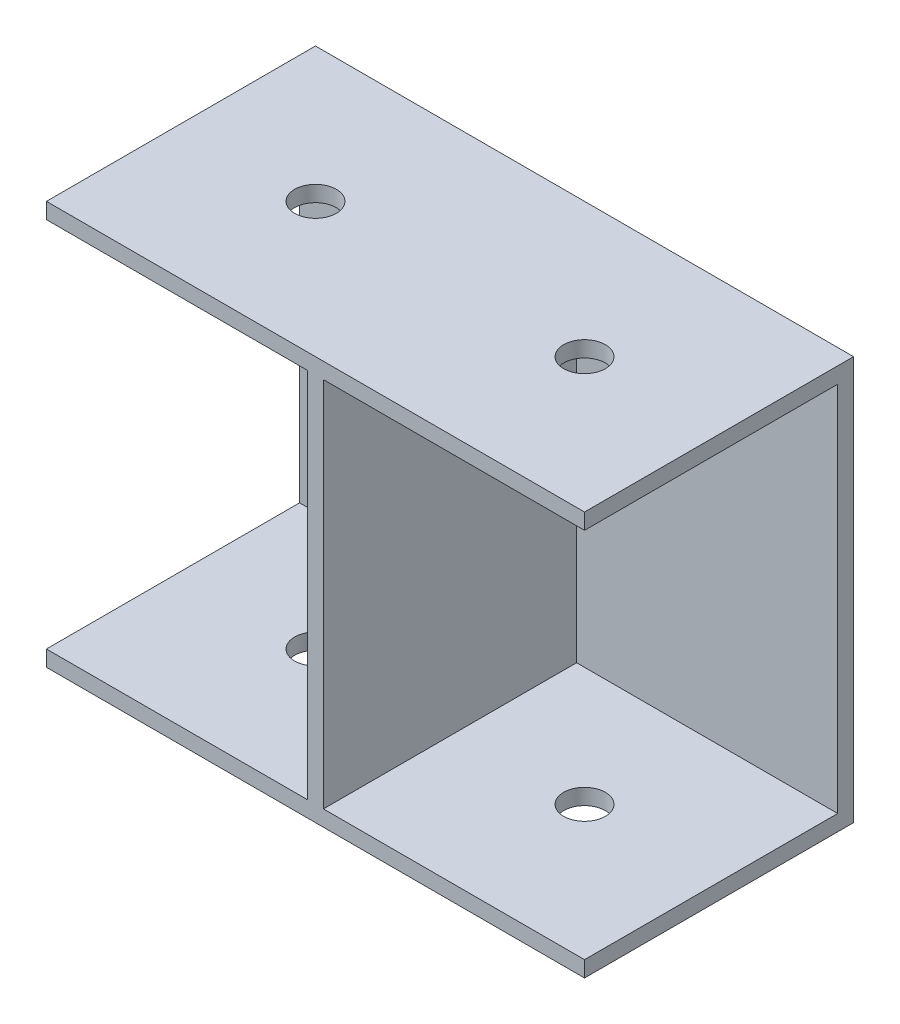
ISO-10303-21;
HEADER;
FILE_DESCRIPTION(('STEP AP214'),'2;1');
FILE_NAME('part.step','',(''),(''),'','','');
FILE_SCHEMA(('AUTOMOTIVE_DESIGN { 1 0 10303 214 1 1 1 1 }'));
ENDSEC;
DATA;
#1=APPLICATION_CONTEXT('core data for automotive mechanical design processes');
#2=APPLICATION_PROTOCOL_DEFINITION('international standard','automotive_design',2000,#1);
#3=PRODUCT_CONTEXT('',#1,'mechanical');
#4=PRODUCT('Part','Part','',(#3));
#5=PRODUCT_RELATED_PRODUCT_CATEGORY('part','',(#4));
#6=PRODUCT_DEFINITION_FORMATION('','',#4);
#7=PRODUCT_DEFINITION_CONTEXT('part definition',#1,'design');
#8=PRODUCT_DEFINITION('design','',#6,#7);
#9=PRODUCT_DEFINITION_SHAPE('','',#8);
#10=(LENGTH_UNIT() NAMED_UNIT(*) SI_UNIT(.MILLI.,.METRE.));
#11=(NAMED_UNIT(*) PLANE_ANGLE_UNIT() SI_UNIT($,.RADIAN.));
#12=(NAMED_UNIT(*) SI_UNIT($,.STERADIAN.) SOLID_ANGLE_UNIT());
#13=UNCERTAINTY_MEASURE_WITH_UNIT(LENGTH_MEASURE(1.E-05),#10,'distance_accuracy_value','');
#14=(GEOMETRIC_REPRESENTATION_CONTEXT(3) GLOBAL_UNCERTAINTY_ASSIGNED_CONTEXT((#13)) GLOBAL_UNIT_ASSIGNED_CONTEXT((#10,
#11,#12)) REPRESENTATION_CONTEXT('',''));
#15=CARTESIAN_POINT('',(0.,0.,0.));
#16=DIRECTION('',(0.,0.,1.));
#17=DIRECTION('',(1.,0.,0.));
#18=AXIS2_PLACEMENT_3D('',#15,#16,#17);
#19=CARTESIAN_POINT('',(50.8,-38.1,50.8));
#20=DIRECTION('',(-1.,0.,0.));
#21=DIRECTION('',(0.,0.,1.));
#22=AXIS2_PLACEMENT_3D('',#19,#20,#21);
#23=PLANE('',#22);
#24=DIRECTION('',(0.,1.,0.));
#25=VECTOR('',#24,1.);
#26=CARTESIAN_POINT('',(50.8,-38.1,50.8));
#27=LINE('',#26,#25);
#28=CARTESIAN_POINT('',(50.8,35.1,50.8));
#29=VERTEX_POINT('',#28);
#30=CARTESIAN_POINT('',(50.8,38.1,50.8));
#31=VERTEX_POINT('',#30);
#32=EDGE_CURVE('E191',#29,#31,#27,.T.);
#33=ORIENTED_EDGE('',*,*,#32,.F.);
#34=DIRECTION('',(0.,0.,1.));
#35=VECTOR('',#34,1.);
#36=CARTESIAN_POINT('',(50.8,35.1,3.));
#37=LINE('',#36,#35);
#38=CARTESIAN_POINT('',(50.8,35.1,3.));
#39=VERTEX_POINT('',#38);
#40=EDGE_CURVE('E181',#39,#29,#37,.T.);
#41=ORIENTED_EDGE('',*,*,#40,.F.);
#42=DIRECTION('',(0.,1.,0.));
#43=VECTOR('',#42,1.);
#44=CARTESIAN_POINT('',(50.8,-35.1,3.));
#45=LINE('',#44,#43);
#46=CARTESIAN_POINT('',(50.8,-35.1,3.));
#47=VERTEX_POINT('',#46);
#48=EDGE_CURVE('E167',#47,#39,#45,.T.);
#49=ORIENTED_EDGE('',*,*,#48,.F.);
#50=DIRECTION('',(0.,0.,1.));
#51=VECTOR('',#50,1.);
#52=CARTESIAN_POINT('',(50.8,-35.1,3.));
#53=LINE('',#52,#51);
#54=CARTESIAN_POINT('',(50.8,-35.1,50.8));
#55=VERTEX_POINT('',#54);
#56=EDGE_CURVE('E183',#47,#55,#53,.T.);
#57=ORIENTED_EDGE('',*,*,#56,.T.);
#58=CARTESIAN_POINT('',(50.8,-38.1,50.8));
#59=VERTEX_POINT('',#58);
#60=EDGE_CURVE('E187',#59,#55,#27,.T.);
#61=ORIENTED_EDGE('',*,*,#60,.F.);
#62=DIRECTION('',(0.,0.,-1.));
#63=VECTOR('',#62,1.);
#64=CARTESIAN_POINT('',(50.8,-38.1,50.8));
#65=LINE('',#64,#63);
#66=CARTESIAN_POINT('',(50.8,-38.1,0.));
#67=VERTEX_POINT('',#66);
#68=EDGE_CURVE('E199',#59,#67,#65,.T.);
#69=ORIENTED_EDGE('',*,*,#68,.T.);
#70=DIRECTION('',(0.,1.,0.));
#71=VECTOR('',#70,1.);
#72=CARTESIAN_POINT('',(50.8,-38.1,0.));
#73=LINE('',#72,#71);
#74=CARTESIAN_POINT('',(50.8,38.1,0.));
#75=VERTEX_POINT('',#74);
#76=EDGE_CURVE('E180',#67,#75,#73,.T.);
#77=ORIENTED_EDGE('',*,*,#76,.T.);
#78=DIRECTION('',(0.,0.,-1.));
#79=VECTOR('',#78,1.);
#80=CARTESIAN_POINT('',(50.8,38.1,50.8));
#81=LINE('',#80,#79);
#82=EDGE_CURVE('E11',#31,#75,#81,.T.);
#83=ORIENTED_EDGE('',*,*,#82,.F.);
#84=EDGE_LOOP('',(#33,#41,#49,#57,#61,#69,#77,#83));
#85=FACE_BOUND('',#84,.T.);
#86=ADVANCED_FACE('F32',(#85),#23,.F.);
#87=CARTESIAN_POINT('',(-50.8,38.1,50.8));
#88=DIRECTION('',(0.,-1.,0.));
#89=DIRECTION('',(0.,0.,-1.));
#90=AXIS2_PLACEMENT_3D('',#87,#88,#89);
#91=PLANE('',#90);
#92=CARTESIAN_POINT('',(-25.4,38.1,25.4));
#93=DIRECTION('',(0.,-1.,0.));
#94=DIRECTION('',(0.,0.,-1.));
#95=AXIS2_PLACEMENT_3D('',#92,#93,#94);
#96=CIRCLE('',#95,3.937);
#97=CARTESIAN_POINT('',(-25.4,38.1,21.463));
#98=VERTEX_POINT('',#97);
#99=EDGE_CURVE('E217',#98,#98,#96,.T.);
#100=ORIENTED_EDGE('',*,*,#99,.T.);
#101=EDGE_LOOP('',(#100));
#102=FACE_BOUND('',#101,.T.);
#103=CARTESIAN_POINT('',(25.4,38.1,25.4));
#104=DIRECTION('',(0.,-1.,0.));
#105=DIRECTION('',(0.,0.,-1.));
#106=AXIS2_PLACEMENT_3D('',#103,#104,#105);
#107=CIRCLE('',#106,3.937);
#108=CARTESIAN_POINT('',(25.4,38.1,21.463));
#109=VERTEX_POINT('',#108);
#110=EDGE_CURVE('E147',#109,#109,#107,.T.);
#111=ORIENTED_EDGE('',*,*,#110,.T.);
#112=EDGE_LOOP('',(#111));
#113=FACE_BOUND('',#112,.T.);
#114=DIRECTION('',(-1.,0.,0.));
#115=VECTOR('',#114,1.);
#116=CARTESIAN_POINT('',(-50.8,38.1,0.));
#117=LINE('',#116,#115);
#118=CARTESIAN_POINT('',(-50.8,38.1,0.));
#119=VERTEX_POINT('',#118);
#120=EDGE_CURVE('E202',#75,#119,#117,.T.);
#121=ORIENTED_EDGE('',*,*,#120,.T.);
#122=DIRECTION('',(0.,0.,-1.));
#123=VECTOR('',#122,1.);
#124=CARTESIAN_POINT('',(-50.8,38.1,50.8));
#125=LINE('',#124,#123);
#126=CARTESIAN_POINT('',(-50.8,38.1,50.8));
#127=VERTEX_POINT('',#126);
#128=EDGE_CURVE('E40',#127,#119,#125,.T.);
#129=ORIENTED_EDGE('',*,*,#128,.F.);
#130=DIRECTION('',(-1.,0.,0.));
#131=VECTOR('',#130,1.);
#132=CARTESIAN_POINT('',(-50.8,38.1,50.8));
#133=LINE('',#132,#131);
#134=EDGE_CURVE('E190',#31,#127,#133,.T.);
#135=ORIENTED_EDGE('',*,*,#134,.F.);
#136=ORIENTED_EDGE('',*,*,#82,.T.);
#137=EDGE_LOOP('',(#121,#129,#135,#136));
#138=FACE_BOUND('',#137,.T.);
#139=ADVANCED_FACE('F238',(#102,#113,#138),#91,.F.);
#140=CARTESIAN_POINT('',(-50.8,-38.1,50.8));
#141=DIRECTION('',(1.,0.,0.));
#142=DIRECTION('',(0.,0.,-1.));
#143=AXIS2_PLACEMENT_3D('',#140,#141,#142);
#144=PLANE('',#143);
#145=DIRECTION('',(0.,-1.,0.));
#146=VECTOR('',#145,1.);
#147=CARTESIAN_POINT('',(-50.8,-38.1,50.8));
#148=LINE('',#147,#146);
#149=CARTESIAN_POINT('',(-50.8,-35.1,50.8));
#150=VERTEX_POINT('',#149);
#151=CARTESIAN_POINT('',(-50.8,-38.1,50.8));
#152=VERTEX_POINT('',#151);
#153=EDGE_CURVE('E193',#150,#152,#148,.T.);
#154=ORIENTED_EDGE('',*,*,#153,.F.);
#155=DIRECTION('',(0.,0.,1.));
#156=VECTOR('',#155,1.);
#157=CARTESIAN_POINT('',(-50.8,-35.1,3.));
#158=LINE('',#157,#156);
#159=CARTESIAN_POINT('',(-50.8,-35.1,3.));
#160=VERTEX_POINT('',#159);
#161=EDGE_CURVE('E154',#160,#150,#158,.T.);
#162=ORIENTED_EDGE('',*,*,#161,.F.);
#163=DIRECTION('',(0.,-1.,0.));
#164=VECTOR('',#163,1.);
#165=CARTESIAN_POINT('',(-50.8,-35.1,3.));
#166=LINE('',#165,#164);
#167=CARTESIAN_POINT('',(-50.8,35.1,3.));
#168=VERTEX_POINT('',#167);
#169=EDGE_CURVE('E129',#168,#160,#166,.T.);
#170=ORIENTED_EDGE('',*,*,#169,.F.);
#171=DIRECTION('',(0.,0.,1.));
#172=VECTOR('',#171,1.);
#173=CARTESIAN_POINT('',(-50.8,35.1,3.));
#174=LINE('',#173,#172);
#175=CARTESIAN_POINT('',(-50.8,35.1,50.8));
#176=VERTEX_POINT('',#175);
#177=EDGE_CURVE('E156',#168,#176,#174,.T.);
#178=ORIENTED_EDGE('',*,*,#177,.T.);
#179=EDGE_CURVE('E194',#127,#176,#148,.T.);
#180=ORIENTED_EDGE('',*,*,#179,.F.);
#181=ORIENTED_EDGE('',*,*,#128,.T.);
#182=DIRECTION('',(0.,-1.,0.));
#183=VECTOR('',#182,1.);
#184=CARTESIAN_POINT('',(-50.8,-38.1,0.));
#185=LINE('',#184,#183);
#186=CARTESIAN_POINT('',(-50.8,-38.1,0.));
#187=VERTEX_POINT('',#186);
#188=EDGE_CURVE('E204',#119,#187,#185,.T.);
#189=ORIENTED_EDGE('',*,*,#188,.T.);
#190=DIRECTION('',(0.,0.,-1.));
#191=VECTOR('',#190,1.);
#192=CARTESIAN_POINT('',(-50.8,-38.1,50.8));
#193=LINE('',#192,#191);
#194=EDGE_CURVE('E210',#152,#187,#193,.T.);
#195=ORIENTED_EDGE('',*,*,#194,.F.);
#196=EDGE_LOOP('',(#154,#162,#170,#178,#180,#181,#189,#195));
#197=FACE_BOUND('',#196,.T.);
#198=ADVANCED_FACE('F262',(#197),#144,.F.);
#199=CARTESIAN_POINT('',(-50.8,-38.1,50.8));
#200=DIRECTION('',(0.,1.,0.));
#201=DIRECTION('',(0.,0.,1.));
#202=AXIS2_PLACEMENT_3D('',#199,#200,#201);
#203=PLANE('',#202);
#204=CARTESIAN_POINT('',(-25.4,-38.1,25.4));
#205=DIRECTION('',(0.,1.,0.));
#206=DIRECTION('',(0.,0.,1.));
#207=AXIS2_PLACEMENT_3D('',#204,#205,#206);
#208=CIRCLE('',#207,3.937);
#209=CARTESIAN_POINT('',(-25.4,-38.1,29.337));
#210=VERTEX_POINT('',#209);
#211=EDGE_CURVE('E224',#210,#210,#208,.T.);
#212=ORIENTED_EDGE('',*,*,#211,.T.);
#213=EDGE_LOOP('',(#212));
#214=FACE_BOUND('',#213,.T.);
#215=CARTESIAN_POINT('',(25.4,-38.1,25.4));
#216=DIRECTION('',(0.,1.,0.));
#217=DIRECTION('',(0.,0.,1.));
#218=AXIS2_PLACEMENT_3D('',#215,#216,#217);
#219=CIRCLE('',#218,3.937);
#220=CARTESIAN_POINT('',(25.4,-38.1,29.337));
#221=VERTEX_POINT('',#220);
#222=EDGE_CURVE('E221',#221,#221,#219,.T.);
#223=ORIENTED_EDGE('',*,*,#222,.T.);
#224=EDGE_LOOP('',(#223));
#225=FACE_BOUND('',#224,.T.);
#226=DIRECTION('',(1.,0.,0.));
#227=VECTOR('',#226,1.);
#228=CARTESIAN_POINT('',(-50.8,-38.1,0.));
#229=LINE('',#228,#227);
#230=EDGE_CURVE('E206',#187,#67,#229,.T.);
#231=ORIENTED_EDGE('',*,*,#230,.T.);
#232=ORIENTED_EDGE('',*,*,#68,.F.);
#233=DIRECTION('',(1.,0.,0.));
#234=VECTOR('',#233,1.);
#235=CARTESIAN_POINT('',(-50.8,-38.1,50.8));
#236=LINE('',#235,#234);
#237=EDGE_CURVE('E197',#152,#59,#236,.T.);
#238=ORIENTED_EDGE('',*,*,#237,.F.);
#239=ORIENTED_EDGE('',*,*,#194,.T.);
#240=EDGE_LOOP('',(#231,#232,#238,#239));
#241=FACE_BOUND('',#240,.T.);
#242=ADVANCED_FACE('F284',(#214,#225,#241),#203,.F.);
#243=CARTESIAN_POINT('',(0.,0.,50.8));
#244=DIRECTION('',(0.,0.,-1.));
#245=DIRECTION('',(-1.,0.,0.));
#246=AXIS2_PLACEMENT_3D('',#243,#244,#245);
#247=PLANE('',#246);
#248=DIRECTION('',(0.,1.,0.));
#249=VECTOR('',#248,1.);
#250=CARTESIAN_POINT('',(-1.5,-35.1,50.8));
#251=LINE('',#250,#249);
#252=CARTESIAN_POINT('',(-1.5,-35.1,50.8));
#253=VERTEX_POINT('',#252);
#254=CARTESIAN_POINT('',(-1.5,35.1,50.8));
#255=VERTEX_POINT('',#254);
#256=EDGE_CURVE('E144',#253,#255,#251,.T.);
#257=ORIENTED_EDGE('',*,*,#256,.F.);
#258=DIRECTION('',(1.,0.,0.));
#259=VECTOR('',#258,1.);
#260=CARTESIAN_POINT('',(-1.5,-35.1,50.8));
#261=LINE('',#260,#259);
#262=EDGE_CURVE('E48',#150,#253,#261,.T.);
#263=ORIENTED_EDGE('',*,*,#262,.F.);
#264=ORIENTED_EDGE('',*,*,#153,.T.);
#265=ORIENTED_EDGE('',*,*,#237,.T.);
#266=ORIENTED_EDGE('',*,*,#60,.T.);
#267=DIRECTION('',(1.,0.,0.));
#268=VECTOR('',#267,1.);
#269=CARTESIAN_POINT('',(1.5,-35.1,50.8));
#270=LINE('',#269,#268);
#271=CARTESIAN_POINT('',(1.5,-35.1,50.8));
#272=VERTEX_POINT('',#271);
#273=EDGE_CURVE('E174',#272,#55,#270,.T.);
#274=ORIENTED_EDGE('',*,*,#273,.F.);
#275=DIRECTION('',(0.,-1.,0.));
#276=VECTOR('',#275,1.);
#277=CARTESIAN_POINT('',(1.5,-35.1,50.8));
#278=LINE('',#277,#276);
#279=CARTESIAN_POINT('',(1.5,35.1,50.8));
#280=VERTEX_POINT('',#279);
#281=EDGE_CURVE('E56',#280,#272,#278,.T.);
#282=ORIENTED_EDGE('',*,*,#281,.F.);
#283=DIRECTION('',(-1.,0.,0.));
#284=VECTOR('',#283,1.);
#285=CARTESIAN_POINT('',(1.5,35.1,50.8));
#286=LINE('',#285,#284);
#287=EDGE_CURVE('E164',#29,#280,#286,.T.);
#288=ORIENTED_EDGE('',*,*,#287,.F.);
#289=ORIENTED_EDGE('',*,*,#32,.T.);
#290=ORIENTED_EDGE('',*,*,#134,.T.);
#291=ORIENTED_EDGE('',*,*,#179,.T.);
#292=DIRECTION('',(-1.,0.,0.));
#293=VECTOR('',#292,1.);
#294=CARTESIAN_POINT('',(-1.5,35.1,50.8));
#295=LINE('',#294,#293);
#296=EDGE_CURVE('E142',#255,#176,#295,.T.);
#297=ORIENTED_EDGE('',*,*,#296,.F.);
#298=EDGE_LOOP('',(#257,#263,#264,#265,#266,#274,#282,#288,#289,#290,#291,#297));
#299=FACE_BOUND('',#298,.T.);
#300=ADVANCED_FACE('F270',(#299),#247,.F.);
#301=CARTESIAN_POINT('',(0.,0.,0.));
#302=DIRECTION('',(0.,0.,-1.));
#303=DIRECTION('',(-1.,0.,0.));
#304=AXIS2_PLACEMENT_3D('',#301,#302,#303);
#305=PLANE('',#304);
#306=ORIENTED_EDGE('',*,*,#76,.F.);
#307=ORIENTED_EDGE('',*,*,#230,.F.);
#308=ORIENTED_EDGE('',*,*,#188,.F.);
#309=ORIENTED_EDGE('',*,*,#120,.F.);
#310=EDGE_LOOP('',(#306,#307,#308,#309));
#311=FACE_BOUND('',#310,.T.);
#312=ADVANCED_FACE('F306',(#311),#305,.T.);
#313=CARTESIAN_POINT('',(1.5,-35.1,3.));
#314=DIRECTION('',(-1.,0.,0.));
#315=DIRECTION('',(0.,0.,1.));
#316=AXIS2_PLACEMENT_3D('',#313,#314,#315);
#317=PLANE('',#316);
#318=ORIENTED_EDGE('',*,*,#281,.T.);
#319=DIRECTION('',(0.,0.,1.));
#320=VECTOR('',#319,1.);
#321=CARTESIAN_POINT('',(1.5,-35.1,3.));
#322=LINE('',#321,#320);
#323=CARTESIAN_POINT('',(1.5,-35.1,3.));
#324=VERTEX_POINT('',#323);
#325=EDGE_CURVE('E172',#324,#272,#322,.T.);
#326=ORIENTED_EDGE('',*,*,#325,.F.);
#327=DIRECTION('',(0.,-1.,0.));
#328=VECTOR('',#327,1.);
#329=CARTESIAN_POINT('',(1.5,-35.1,3.));
#330=LINE('',#329,#328);
#331=CARTESIAN_POINT('',(1.5,35.1,3.));
#332=VERTEX_POINT('',#331);
#333=EDGE_CURVE('E160',#332,#324,#330,.T.);
#334=ORIENTED_EDGE('',*,*,#333,.F.);
#335=DIRECTION('',(0.,0.,1.));
#336=VECTOR('',#335,1.);
#337=CARTESIAN_POINT('',(1.5,35.1,3.));
#338=LINE('',#337,#336);
#339=EDGE_CURVE('E178',#332,#280,#338,.T.);
#340=ORIENTED_EDGE('',*,*,#339,.T.);
#341=EDGE_LOOP('',(#318,#326,#334,#340));
#342=FACE_BOUND('',#341,.T.);
#343=ADVANCED_FACE('F292',(#342),#317,.F.);
#344=CARTESIAN_POINT('',(1.5,35.1,3.));
#345=DIRECTION('',(0.,1.,0.));
#346=DIRECTION('',(0.,0.,1.));
#347=AXIS2_PLACEMENT_3D('',#344,#345,#346);
#348=PLANE('',#347);
#349=CARTESIAN_POINT('',(25.4,35.1,25.4));
#350=DIRECTION('',(0.,1.,0.));
#351=DIRECTION('',(0.,0.,1.));
#352=AXIS2_PLACEMENT_3D('',#349,#350,#351);
#353=CIRCLE('',#352,3.937);
#354=CARTESIAN_POINT('',(25.4,35.1,29.337));
#355=VERTEX_POINT('',#354);
#356=EDGE_CURVE('E216',#355,#355,#353,.T.);
#357=ORIENTED_EDGE('',*,*,#356,.T.);
#358=EDGE_LOOP('',(#357));
#359=FACE_BOUND('',#358,.T.);
#360=ORIENTED_EDGE('',*,*,#287,.T.);
#361=ORIENTED_EDGE('',*,*,#339,.F.);
#362=DIRECTION('',(-1.,0.,0.));
#363=VECTOR('',#362,1.);
#364=CARTESIAN_POINT('',(1.5,35.1,3.));
#365=LINE('',#364,#363);
#366=EDGE_CURVE('E169',#39,#332,#365,.T.);
#367=ORIENTED_EDGE('',*,*,#366,.F.);
#368=ORIENTED_EDGE('',*,*,#40,.T.);
#369=EDGE_LOOP('',(#360,#361,#367,#368));
#370=FACE_BOUND('',#369,.T.);
#371=ADVANCED_FACE('F297',(#359,#370),#348,.F.);
#372=CARTESIAN_POINT('',(1.5,-35.1,3.));
#373=DIRECTION('',(0.,-1.,0.));
#374=DIRECTION('',(0.,0.,-1.));
#375=AXIS2_PLACEMENT_3D('',#372,#373,#374);
#376=PLANE('',#375);
#377=CARTESIAN_POINT('',(25.4,-35.1,25.4));
#378=DIRECTION('',(0.,-1.,0.));
#379=DIRECTION('',(0.,0.,-1.));
#380=AXIS2_PLACEMENT_3D('',#377,#378,#379);
#381=CIRCLE('',#380,3.937);
#382=CARTESIAN_POINT('',(25.4,-35.1,21.463));
#383=VERTEX_POINT('',#382);
#384=EDGE_CURVE('E214',#383,#383,#381,.T.);
#385=ORIENTED_EDGE('',*,*,#384,.T.);
#386=EDGE_LOOP('',(#385));
#387=FACE_BOUND('',#386,.T.);
#388=ORIENTED_EDGE('',*,*,#273,.T.);
#389=ORIENTED_EDGE('',*,*,#56,.F.);
#390=DIRECTION('',(1.,0.,0.));
#391=VECTOR('',#390,1.);
#392=CARTESIAN_POINT('',(1.5,-35.1,3.));
#393=LINE('',#392,#391);
#394=EDGE_CURVE('E163',#324,#47,#393,.T.);
#395=ORIENTED_EDGE('',*,*,#394,.F.);
#396=ORIENTED_EDGE('',*,*,#325,.T.);
#397=EDGE_LOOP('',(#388,#389,#395,#396));
#398=FACE_BOUND('',#397,.T.);
#399=ADVANCED_FACE('F289',(#387,#398),#376,.F.);
#400=CARTESIAN_POINT('',(0.,0.,3.));
#401=DIRECTION('',(0.,0.,-1.));
#402=DIRECTION('',(-1.,0.,0.));
#403=AXIS2_PLACEMENT_3D('',#400,#401,#402);
#404=PLANE('',#403);
#405=ORIENTED_EDGE('',*,*,#333,.T.);
#406=ORIENTED_EDGE('',*,*,#394,.T.);
#407=ORIENTED_EDGE('',*,*,#48,.T.);
#408=ORIENTED_EDGE('',*,*,#366,.T.);
#409=EDGE_LOOP('',(#405,#406,#407,#408));
#410=FACE_BOUND('',#409,.T.);
#411=ADVANCED_FACE('F295',(#410),#404,.F.);
#412=CARTESIAN_POINT('',(-1.5,-35.1,3.));
#413=DIRECTION('',(0.,-1.,0.));
#414=DIRECTION('',(0.,0.,-1.));
#415=AXIS2_PLACEMENT_3D('',#412,#413,#414);
#416=PLANE('',#415);
#417=CARTESIAN_POINT('',(-25.4,-35.1,25.4));
#418=DIRECTION('',(0.,-1.,0.));
#419=DIRECTION('',(0.,0.,-1.));
#420=AXIS2_PLACEMENT_3D('',#417,#418,#419);
#421=CIRCLE('',#420,3.937);
#422=CARTESIAN_POINT('',(-25.4,-35.1,21.463));
#423=VERTEX_POINT('',#422);
#424=EDGE_CURVE('E229',#423,#423,#421,.T.);
#425=ORIENTED_EDGE('',*,*,#424,.T.);
#426=EDGE_LOOP('',(#425));
#427=FACE_BOUND('',#426,.T.);
#428=ORIENTED_EDGE('',*,*,#262,.T.);
#429=DIRECTION('',(0.,0.,1.));
#430=VECTOR('',#429,1.);
#431=CARTESIAN_POINT('',(-1.5,-35.1,3.));
#432=LINE('',#431,#430);
#433=CARTESIAN_POINT('',(-1.5,-35.1,3.));
#434=VERTEX_POINT('',#433);
#435=EDGE_CURVE('E119',#434,#253,#432,.T.);
#436=ORIENTED_EDGE('',*,*,#435,.F.);
#437=DIRECTION('',(1.,0.,0.));
#438=VECTOR('',#437,1.);
#439=CARTESIAN_POINT('',(-1.5,-35.1,3.));
#440=LINE('',#439,#438);
#441=EDGE_CURVE('E123',#160,#434,#440,.T.);
#442=ORIENTED_EDGE('',*,*,#441,.F.);
#443=ORIENTED_EDGE('',*,*,#161,.T.);
#444=EDGE_LOOP('',(#428,#436,#442,#443));
#445=FACE_BOUND('',#444,.T.);
#446=ADVANCED_FACE('F121',(#427,#445),#416,.F.);
#447=CARTESIAN_POINT('',(-1.5,35.1,3.));
#448=DIRECTION('',(0.,1.,0.));
#449=DIRECTION('',(0.,0.,1.));
#450=AXIS2_PLACEMENT_3D('',#447,#448,#449);
#451=PLANE('',#450);
#452=CARTESIAN_POINT('',(-25.4,35.1,25.4));
#453=DIRECTION('',(0.,1.,0.));
#454=DIRECTION('',(0.,0.,1.));
#455=AXIS2_PLACEMENT_3D('',#452,#453,#454);
#456=CIRCLE('',#455,3.937);
#457=CARTESIAN_POINT('',(-25.4,35.1,29.337));
#458=VERTEX_POINT('',#457);
#459=EDGE_CURVE('E35',#458,#458,#456,.T.);
#460=ORIENTED_EDGE('',*,*,#459,.T.);
#461=EDGE_LOOP('',(#460));
#462=FACE_BOUND('',#461,.T.);
#463=ORIENTED_EDGE('',*,*,#296,.T.);
#464=ORIENTED_EDGE('',*,*,#177,.F.);
#465=DIRECTION('',(-1.,0.,0.));
#466=VECTOR('',#465,1.);
#467=CARTESIAN_POINT('',(-1.5,35.1,3.));
#468=LINE('',#467,#466);
#469=CARTESIAN_POINT('',(-1.5,35.1,3.));
#470=VERTEX_POINT('',#469);
#471=EDGE_CURVE('E137',#470,#168,#468,.T.);
#472=ORIENTED_EDGE('',*,*,#471,.F.);
#473=DIRECTION('',(0.,0.,1.));
#474=VECTOR('',#473,1.);
#475=CARTESIAN_POINT('',(-1.5,35.1,3.));
#476=LINE('',#475,#474);
#477=EDGE_CURVE('E128',#470,#255,#476,.T.);
#478=ORIENTED_EDGE('',*,*,#477,.T.);
#479=EDGE_LOOP('',(#463,#464,#472,#478));
#480=FACE_BOUND('',#479,.T.);
#481=ADVANCED_FACE('F278',(#462,#480),#451,.F.);
#482=CARTESIAN_POINT('',(-1.5,-35.1,3.));
#483=DIRECTION('',(1.,0.,0.));
#484=DIRECTION('',(0.,0.,-1.));
#485=AXIS2_PLACEMENT_3D('',#482,#483,#484);
#486=PLANE('',#485);
#487=ORIENTED_EDGE('',*,*,#256,.T.);
#488=ORIENTED_EDGE('',*,*,#477,.F.);
#489=DIRECTION('',(0.,1.,0.));
#490=VECTOR('',#489,1.);
#491=CARTESIAN_POINT('',(-1.5,-35.1,3.));
#492=LINE('',#491,#490);
#493=EDGE_CURVE('E132',#434,#470,#492,.T.);
#494=ORIENTED_EDGE('',*,*,#493,.F.);
#495=ORIENTED_EDGE('',*,*,#435,.T.);
#496=EDGE_LOOP('',(#487,#488,#494,#495));
#497=FACE_BOUND('',#496,.T.);
#498=ADVANCED_FACE('F133',(#497),#486,.F.);
#499=CARTESIAN_POINT('',(0.,0.,3.));
#500=DIRECTION('',(0.,0.,-1.));
#501=DIRECTION('',(-1.,0.,0.));
#502=AXIS2_PLACEMENT_3D('',#499,#500,#501);
#503=PLANE('',#502);
#504=ORIENTED_EDGE('',*,*,#441,.T.);
#505=ORIENTED_EDGE('',*,*,#493,.T.);
#506=ORIENTED_EDGE('',*,*,#471,.T.);
#507=ORIENTED_EDGE('',*,*,#169,.T.);
#508=EDGE_LOOP('',(#504,#505,#506,#507));
#509=FACE_BOUND('',#508,.T.);
#510=ADVANCED_FACE('F139',(#509),#503,.F.);
#511=CARTESIAN_POINT('',(25.4,-50.8,25.4));
#512=DIRECTION('',(0.,1.,0.));
#513=DIRECTION('',(0.,0.,1.));
#514=AXIS2_PLACEMENT_3D('',#511,#512,#513);
#515=CYLINDRICAL_SURFACE('',#514,3.937);
#516=ORIENTED_EDGE('',*,*,#384,.F.);
#517=EDGE_LOOP('',(#516));
#518=FACE_BOUND('',#517,.T.);
#519=ORIENTED_EDGE('',*,*,#222,.F.);
#520=EDGE_LOOP('',(#519));
#521=FACE_BOUND('',#520,.T.);
#522=ADVANCED_FACE('F244',(#518,#521),#515,.F.);
#523=ORIENTED_EDGE('',*,*,#356,.F.);
#524=EDGE_LOOP('',(#523));
#525=FACE_BOUND('',#524,.T.);
#526=ORIENTED_EDGE('',*,*,#110,.F.);
#527=EDGE_LOOP('',(#526));
#528=FACE_BOUND('',#527,.T.);
#529=ADVANCED_FACE('F241',(#525,#528),#515,.F.);
#530=CARTESIAN_POINT('',(-25.4,-50.8,25.4));
#531=DIRECTION('',(0.,1.,0.));
#532=DIRECTION('',(0.,0.,1.));
#533=AXIS2_PLACEMENT_3D('',#530,#531,#532);
#534=CYLINDRICAL_SURFACE('',#533,3.937);
#535=ORIENTED_EDGE('',*,*,#459,.F.);
#536=EDGE_LOOP('',(#535));
#537=FACE_BOUND('',#536,.T.);
#538=ORIENTED_EDGE('',*,*,#99,.F.);
#539=EDGE_LOOP('',(#538));
#540=FACE_BOUND('',#539,.T.);
#541=ADVANCED_FACE('F243',(#537,#540),#534,.F.);
#542=ORIENTED_EDGE('',*,*,#424,.F.);
#543=EDGE_LOOP('',(#542));
#544=FACE_BOUND('',#543,.T.);
#545=ORIENTED_EDGE('',*,*,#211,.F.);
#546=EDGE_LOOP('',(#545));
#547=FACE_BOUND('',#546,.T.);
#548=ADVANCED_FACE('F251',(#544,#547),#534,.F.);
#549=CLOSED_SHELL('',(#86,#139,#198,#242,#300,#312,#343,#371,#399,#411,#446,#481,#498,#510,#522,
#529,#541,#548));
#550=MANIFOLD_SOLID_BREP('B2',#549);
#551=ADVANCED_BREP_SHAPE_REPRESENTATION('',(#18,#550),#14);
#552=SHAPE_DEFINITION_REPRESENTATION(#9,#551);
ENDSEC;
END-ISO-10303-21;
